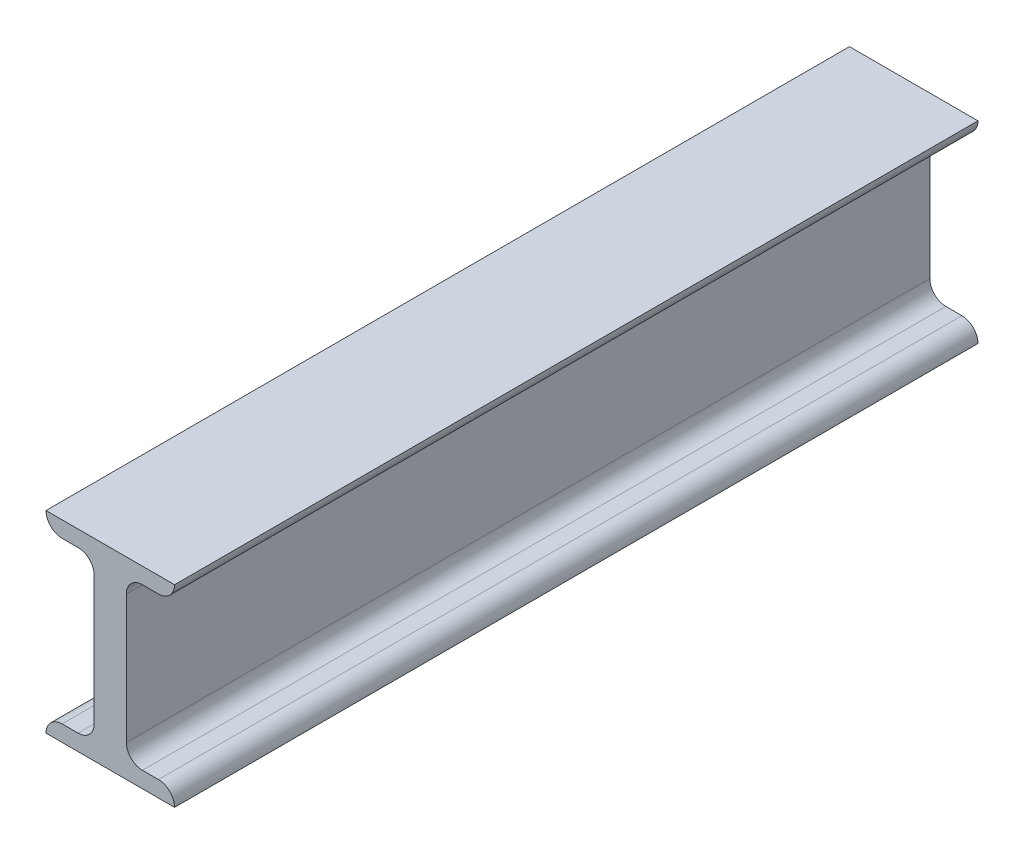
ISO-10303-21;
HEADER;
FILE_DESCRIPTION(('STEP AP214'),'2;1');
FILE_NAME('part.step','',(''),(''),'','','');
FILE_SCHEMA(('AUTOMOTIVE_DESIGN { 1 0 10303 214 1 1 1 1 }'));
ENDSEC;
DATA;
#1=APPLICATION_CONTEXT('core data for automotive mechanical design processes');
#2=APPLICATION_PROTOCOL_DEFINITION('international standard','automotive_design',2000,#1);
#3=PRODUCT_CONTEXT('',#1,'mechanical');
#4=PRODUCT('Part','Part','',(#3));
#5=PRODUCT_RELATED_PRODUCT_CATEGORY('part','',(#4));
#6=PRODUCT_DEFINITION_FORMATION('','',#4);
#7=PRODUCT_DEFINITION_CONTEXT('part definition',#1,'design');
#8=PRODUCT_DEFINITION('design','',#6,#7);
#9=PRODUCT_DEFINITION_SHAPE('','',#8);
#10=(LENGTH_UNIT() NAMED_UNIT(*) SI_UNIT(.MILLI.,.METRE.));
#11=(NAMED_UNIT(*) PLANE_ANGLE_UNIT() SI_UNIT($,.RADIAN.));
#12=(NAMED_UNIT(*) SI_UNIT($,.STERADIAN.) SOLID_ANGLE_UNIT());
#13=UNCERTAINTY_MEASURE_WITH_UNIT(LENGTH_MEASURE(1.E-05),#10,'distance_accuracy_value','');
#14=(GEOMETRIC_REPRESENTATION_CONTEXT(3) GLOBAL_UNCERTAINTY_ASSIGNED_CONTEXT((#13)) GLOBAL_UNIT_ASSIGNED_CONTEXT((#10,
#11,#12)) REPRESENTATION_CONTEXT('',''));
#15=CARTESIAN_POINT('',(0.,0.,0.));
#16=DIRECTION('',(0.,0.,1.));
#17=DIRECTION('',(1.,0.,0.));
#18=AXIS2_PLACEMENT_3D('',#15,#16,#17);
#19=CARTESIAN_POINT('',(0.,0.,250.));
#20=DIRECTION('',(0.,1.,0.));
#21=DIRECTION('',(0.,0.,1.));
#22=AXIS2_PLACEMENT_3D('',#19,#20,#21);
#23=PLANE('',#22);
#24=DIRECTION('',(1.,0.,0.));
#25=VECTOR('',#24,1.);
#26=CARTESIAN_POINT('',(0.,0.,0.));
#27=LINE('',#26,#25);
#28=CARTESIAN_POINT('',(0.,0.,0.));
#29=VERTEX_POINT('',#28);
#30=CARTESIAN_POINT('',(40.,0.,0.));
#31=VERTEX_POINT('',#30);
#32=EDGE_CURVE('E343',#29,#31,#27,.T.);
#33=ORIENTED_EDGE('',*,*,#32,.T.);
#34=DIRECTION('',(0.,0.,-1.));
#35=VECTOR('',#34,1.);
#36=CARTESIAN_POINT('',(40.,0.,250.));
#37=LINE('',#36,#35);
#38=CARTESIAN_POINT('',(40.,0.,250.));
#39=VERTEX_POINT('',#38);
#40=EDGE_CURVE('E175',#39,#31,#37,.T.);
#41=ORIENTED_EDGE('',*,*,#40,.F.);
#42=DIRECTION('',(1.,0.,0.));
#43=VECTOR('',#42,1.);
#44=CARTESIAN_POINT('',(0.,0.,250.));
#45=LINE('',#44,#43);
#46=CARTESIAN_POINT('',(0.,0.,250.));
#47=VERTEX_POINT('',#46);
#48=EDGE_CURVE('E161',#47,#39,#45,.T.);
#49=ORIENTED_EDGE('',*,*,#48,.F.);
#50=DIRECTION('',(0.,0.,-1.));
#51=VECTOR('',#50,1.);
#52=CARTESIAN_POINT('',(0.,0.,250.));
#53=LINE('',#52,#51);
#54=EDGE_CURVE('E173',#47,#29,#53,.T.);
#55=ORIENTED_EDGE('',*,*,#54,.T.);
#56=EDGE_LOOP('',(#33,#41,#49,#55));
#57=FACE_BOUND('',#56,.T.);
#58=ADVANCED_FACE('F44',(#57),#23,.F.);
#59=CARTESIAN_POINT('',(40.,5.,250.));
#60=DIRECTION('',(0.,-1.,0.));
#61=DIRECTION('',(0.,0.,-1.));
#62=AXIS2_PLACEMENT_3D('',#59,#60,#61);
#63=PLANE('',#62);
#64=DIRECTION('',(-1.,0.,0.));
#65=VECTOR('',#64,1.);
#66=CARTESIAN_POINT('',(40.,5.,250.));
#67=LINE('',#66,#65);
#68=CARTESIAN_POINT('',(35.,5.,250.));
#69=VERTEX_POINT('',#68);
#70=CARTESIAN_POINT('',(30.,5.,250.));
#71=VERTEX_POINT('',#70);
#72=EDGE_CURVE('E178',#69,#71,#67,.T.);
#73=ORIENTED_EDGE('',*,*,#72,.F.);
#74=DIRECTION('',(0.,0.,-1.));
#75=VECTOR('',#74,1.);
#76=CARTESIAN_POINT('',(35.,5.,250.));
#77=LINE('',#76,#75);
#78=CARTESIAN_POINT('',(35.,5.,0.));
#79=VERTEX_POINT('',#78);
#80=EDGE_CURVE('E229',#69,#79,#77,.T.);
#81=ORIENTED_EDGE('',*,*,#80,.T.);
#82=DIRECTION('',(-1.,0.,0.));
#83=VECTOR('',#82,1.);
#84=CARTESIAN_POINT('',(40.,5.,0.));
#85=LINE('',#84,#83);
#86=CARTESIAN_POINT('',(30.,5.,0.));
#87=VERTEX_POINT('',#86);
#88=EDGE_CURVE('E276',#79,#87,#85,.T.);
#89=ORIENTED_EDGE('',*,*,#88,.T.);
#90=DIRECTION('',(0.,0.,-1.));
#91=VECTOR('',#90,1.);
#92=CARTESIAN_POINT('',(30.,5.,250.));
#93=LINE('',#92,#91);
#94=EDGE_CURVE('E226',#87,#71,#93,.F.);
#95=ORIENTED_EDGE('',*,*,#94,.T.);
#96=EDGE_LOOP('',(#73,#81,#89,#95));
#97=FACE_BOUND('',#96,.T.);
#98=ADVANCED_FACE('F397',(#97),#63,.F.);
#99=CARTESIAN_POINT('',(25.,5.,250.));
#100=DIRECTION('',(-1.,0.,0.));
#101=DIRECTION('',(0.,0.,1.));
#102=AXIS2_PLACEMENT_3D('',#99,#100,#101);
#103=PLANE('',#102);
#104=DIRECTION('',(0.,1.,0.));
#105=VECTOR('',#104,1.);
#106=CARTESIAN_POINT('',(25.,5.,250.));
#107=LINE('',#106,#105);
#108=CARTESIAN_POINT('',(25.,10.,250.));
#109=VERTEX_POINT('',#108);
#110=CARTESIAN_POINT('',(25.,50.,250.));
#111=VERTEX_POINT('',#110);
#112=EDGE_CURVE('E283',#109,#111,#107,.T.);
#113=ORIENTED_EDGE('',*,*,#112,.F.);
#114=DIRECTION('',(0.,0.,-1.));
#115=VECTOR('',#114,1.);
#116=CARTESIAN_POINT('',(25.,10.,0.));
#117=LINE('',#116,#115);
#118=CARTESIAN_POINT('',(25.,10.,0.));
#119=VERTEX_POINT('',#118);
#120=EDGE_CURVE('E236',#109,#119,#117,.T.);
#121=ORIENTED_EDGE('',*,*,#120,.T.);
#122=DIRECTION('',(0.,1.,0.));
#123=VECTOR('',#122,1.);
#124=CARTESIAN_POINT('',(25.,5.,0.));
#125=LINE('',#124,#123);
#126=CARTESIAN_POINT('',(25.,50.,0.));
#127=VERTEX_POINT('',#126);
#128=EDGE_CURVE('E263',#119,#127,#125,.T.);
#129=ORIENTED_EDGE('',*,*,#128,.T.);
#130=DIRECTION('',(0.,0.,-1.));
#131=VECTOR('',#130,1.);
#132=CARTESIAN_POINT('',(25.,50.,250.));
#133=LINE('',#132,#131);
#134=EDGE_CURVE('E233',#127,#111,#133,.F.);
#135=ORIENTED_EDGE('',*,*,#134,.T.);
#136=EDGE_LOOP('',(#113,#121,#129,#135));
#137=FACE_BOUND('',#136,.T.);
#138=ADVANCED_FACE('F272',(#137),#103,.F.);
#139=CARTESIAN_POINT('',(25.,55.,250.));
#140=DIRECTION('',(0.,1.,0.));
#141=DIRECTION('',(0.,0.,1.));
#142=AXIS2_PLACEMENT_3D('',#139,#140,#141);
#143=PLANE('',#142);
#144=DIRECTION('',(1.,0.,0.));
#145=VECTOR('',#144,1.);
#146=CARTESIAN_POINT('',(25.,55.,0.));
#147=LINE('',#146,#145);
#148=CARTESIAN_POINT('',(30.,55.,0.));
#149=VERTEX_POINT('',#148);
#150=CARTESIAN_POINT('',(35.,55.,0.));
#151=VERTEX_POINT('',#150);
#152=EDGE_CURVE('E265',#149,#151,#147,.T.);
#153=ORIENTED_EDGE('',*,*,#152,.T.);
#154=DIRECTION('',(0.,0.,-1.));
#155=VECTOR('',#154,1.);
#156=CARTESIAN_POINT('',(35.,55.,250.));
#157=LINE('',#156,#155);
#158=CARTESIAN_POINT('',(35.,55.,250.));
#159=VERTEX_POINT('',#158);
#160=EDGE_CURVE('E287',#151,#159,#157,.F.);
#161=ORIENTED_EDGE('',*,*,#160,.T.);
#162=DIRECTION('',(1.,0.,0.));
#163=VECTOR('',#162,1.);
#164=CARTESIAN_POINT('',(25.,55.,250.));
#165=LINE('',#164,#163);
#166=CARTESIAN_POINT('',(30.,55.,250.));
#167=VERTEX_POINT('',#166);
#168=EDGE_CURVE('E281',#167,#159,#165,.T.);
#169=ORIENTED_EDGE('',*,*,#168,.F.);
#170=DIRECTION('',(0.,0.,-1.));
#171=VECTOR('',#170,1.);
#172=CARTESIAN_POINT('',(30.,55.,0.));
#173=LINE('',#172,#171);
#174=EDGE_CURVE('E279',#167,#149,#173,.T.);
#175=ORIENTED_EDGE('',*,*,#174,.T.);
#176=EDGE_LOOP('',(#153,#161,#169,#175));
#177=FACE_BOUND('',#176,.T.);
#178=ADVANCED_FACE('F285',(#177),#143,.F.);
#179=CARTESIAN_POINT('',(40.,60.,250.));
#180=DIRECTION('',(0.,-1.,0.));
#181=DIRECTION('',(0.,0.,-1.));
#182=AXIS2_PLACEMENT_3D('',#179,#180,#181);
#183=PLANE('',#182);
#184=DIRECTION('',(-1.,0.,0.));
#185=VECTOR('',#184,1.);
#186=CARTESIAN_POINT('',(40.,60.,0.));
#187=LINE('',#186,#185);
#188=CARTESIAN_POINT('',(40.,60.,0.));
#189=VERTEX_POINT('',#188);
#190=CARTESIAN_POINT('',(0.,60.,0.));
#191=VERTEX_POINT('',#190);
#192=EDGE_CURVE('E318',#189,#191,#187,.T.);
#193=ORIENTED_EDGE('',*,*,#192,.T.);
#194=DIRECTION('',(0.,0.,-1.));
#195=VECTOR('',#194,1.);
#196=CARTESIAN_POINT('',(0.,60.,250.));
#197=LINE('',#196,#195);
#198=CARTESIAN_POINT('',(0.,60.,250.));
#199=VERTEX_POINT('',#198);
#200=EDGE_CURVE('E303',#199,#191,#197,.T.);
#201=ORIENTED_EDGE('',*,*,#200,.F.);
#202=DIRECTION('',(-1.,0.,0.));
#203=VECTOR('',#202,1.);
#204=CARTESIAN_POINT('',(40.,60.,250.));
#205=LINE('',#204,#203);
#206=CARTESIAN_POINT('',(40.,60.,250.));
#207=VERTEX_POINT('',#206);
#208=EDGE_CURVE('E289',#207,#199,#205,.T.);
#209=ORIENTED_EDGE('',*,*,#208,.F.);
#210=DIRECTION('',(0.,0.,-1.));
#211=VECTOR('',#210,1.);
#212=CARTESIAN_POINT('',(40.,60.,250.));
#213=LINE('',#212,#211);
#214=EDGE_CURVE('E191',#207,#189,#213,.T.);
#215=ORIENTED_EDGE('',*,*,#214,.T.);
#216=EDGE_LOOP('',(#193,#201,#209,#215));
#217=FACE_BOUND('',#216,.T.);
#218=ADVANCED_FACE('F316',(#217),#183,.F.);
#219=CARTESIAN_POINT('',(0.,55.,250.));
#220=DIRECTION('',(0.,1.,0.));
#221=DIRECTION('',(0.,0.,1.));
#222=AXIS2_PLACEMENT_3D('',#219,#220,#221);
#223=PLANE('',#222);
#224=DIRECTION('',(1.,0.,0.));
#225=VECTOR('',#224,1.);
#226=CARTESIAN_POINT('',(0.,55.,250.));
#227=LINE('',#226,#225);
#228=CARTESIAN_POINT('',(5.,55.,250.));
#229=VERTEX_POINT('',#228);
#230=CARTESIAN_POINT('',(10.,55.,250.));
#231=VERTEX_POINT('',#230);
#232=EDGE_CURVE('E293',#229,#231,#227,.T.);
#233=ORIENTED_EDGE('',*,*,#232,.F.);
#234=DIRECTION('',(0.,0.,-1.));
#235=VECTOR('',#234,1.);
#236=CARTESIAN_POINT('',(5.,55.,250.));
#237=LINE('',#236,#235);
#238=CARTESIAN_POINT('',(5.,55.,0.));
#239=VERTEX_POINT('',#238);
#240=EDGE_CURVE('E222',#229,#239,#237,.T.);
#241=ORIENTED_EDGE('',*,*,#240,.T.);
#242=DIRECTION('',(1.,0.,0.));
#243=VECTOR('',#242,1.);
#244=CARTESIAN_POINT('',(0.,55.,0.));
#245=LINE('',#244,#243);
#246=CARTESIAN_POINT('',(10.,55.,0.));
#247=VERTEX_POINT('',#246);
#248=EDGE_CURVE('E323',#239,#247,#245,.T.);
#249=ORIENTED_EDGE('',*,*,#248,.T.);
#250=DIRECTION('',(0.,0.,-1.));
#251=VECTOR('',#250,1.);
#252=CARTESIAN_POINT('',(10.,55.,250.));
#253=LINE('',#252,#251);
#254=EDGE_CURVE('E219',#247,#231,#253,.F.);
#255=ORIENTED_EDGE('',*,*,#254,.T.);
#256=EDGE_LOOP('',(#233,#241,#249,#255));
#257=FACE_BOUND('',#256,.T.);
#258=ADVANCED_FACE('F500',(#257),#223,.F.);
#259=CARTESIAN_POINT('',(15.,55.,250.));
#260=DIRECTION('',(1.,0.,0.));
#261=DIRECTION('',(0.,1.,0.));
#262=AXIS2_PLACEMENT_3D('',#259,#260,#261);
#263=PLANE('',#262);
#264=DIRECTION('',(0.,-1.,0.));
#265=VECTOR('',#264,1.);
#266=CARTESIAN_POINT('',(15.,55.,0.));
#267=LINE('',#266,#265);
#268=CARTESIAN_POINT('',(15.,50.,0.));
#269=VERTEX_POINT('',#268);
#270=CARTESIAN_POINT('',(15.,10.,0.));
#271=VERTEX_POINT('',#270);
#272=EDGE_CURVE('E327',#269,#271,#267,.T.);
#273=ORIENTED_EDGE('',*,*,#272,.T.);
#274=DIRECTION('',(0.,0.,-1.));
#275=VECTOR('',#274,1.);
#276=CARTESIAN_POINT('',(15.,10.,250.));
#277=LINE('',#276,#275);
#278=CARTESIAN_POINT('',(15.,10.,250.));
#279=VERTEX_POINT('',#278);
#280=EDGE_CURVE('E216',#271,#279,#277,.F.);
#281=ORIENTED_EDGE('',*,*,#280,.T.);
#282=DIRECTION('',(0.,-1.,0.));
#283=VECTOR('',#282,1.);
#284=CARTESIAN_POINT('',(15.,55.,250.));
#285=LINE('',#284,#283);
#286=CARTESIAN_POINT('',(15.,50.,250.));
#287=VERTEX_POINT('',#286);
#288=EDGE_CURVE('E347',#287,#279,#285,.T.);
#289=ORIENTED_EDGE('',*,*,#288,.F.);
#290=DIRECTION('',(0.,0.,-1.));
#291=VECTOR('',#290,1.);
#292=CARTESIAN_POINT('',(15.,50.,0.));
#293=LINE('',#292,#291);
#294=EDGE_CURVE('E210',#287,#269,#293,.T.);
#295=ORIENTED_EDGE('',*,*,#294,.T.);
#296=EDGE_LOOP('',(#273,#281,#289,#295));
#297=FACE_BOUND('',#296,.T.);
#298=ADVANCED_FACE('F364',(#297),#263,.F.);
#299=CARTESIAN_POINT('',(15.,5.,250.));
#300=DIRECTION('',(0.,-1.,0.));
#301=DIRECTION('',(1.,0.,0.));
#302=AXIS2_PLACEMENT_3D('',#299,#300,#301);
#303=PLANE('',#302);
#304=DIRECTION('',(-1.,0.,0.));
#305=VECTOR('',#304,1.);
#306=CARTESIAN_POINT('',(15.,5.,250.));
#307=LINE('',#306,#305);
#308=CARTESIAN_POINT('',(10.,5.,250.));
#309=VERTEX_POINT('',#308);
#310=CARTESIAN_POINT('',(5.,5.,250.));
#311=VERTEX_POINT('',#310);
#312=EDGE_CURVE('E163',#309,#311,#307,.T.);
#313=ORIENTED_EDGE('',*,*,#312,.F.);
#314=DIRECTION('',(0.,0.,-1.));
#315=VECTOR('',#314,1.);
#316=CARTESIAN_POINT('',(10.,5.,0.));
#317=LINE('',#316,#315);
#318=CARTESIAN_POINT('',(10.,5.,0.));
#319=VERTEX_POINT('',#318);
#320=EDGE_CURVE('E205',#309,#319,#317,.T.);
#321=ORIENTED_EDGE('',*,*,#320,.T.);
#322=DIRECTION('',(-1.,0.,0.));
#323=VECTOR('',#322,1.);
#324=CARTESIAN_POINT('',(15.,5.,0.));
#325=LINE('',#324,#323);
#326=CARTESIAN_POINT('',(5.,5.,0.));
#327=VERTEX_POINT('',#326);
#328=EDGE_CURVE('E179',#319,#327,#325,.T.);
#329=ORIENTED_EDGE('',*,*,#328,.T.);
#330=DIRECTION('',(0.,0.,-1.));
#331=VECTOR('',#330,1.);
#332=CARTESIAN_POINT('',(5.,5.,250.));
#333=LINE('',#332,#331);
#334=EDGE_CURVE('E60',#327,#311,#333,.F.);
#335=ORIENTED_EDGE('',*,*,#334,.T.);
#336=EDGE_LOOP('',(#313,#321,#329,#335));
#337=FACE_BOUND('',#336,.T.);
#338=ADVANCED_FACE('F370',(#337),#303,.F.);
#339=CARTESIAN_POINT('',(0.,0.,250.));
#340=DIRECTION('',(0.,0.,1.));
#341=DIRECTION('',(1.,0.,0.));
#342=AXIS2_PLACEMENT_3D('',#339,#340,#341);
#343=PLANE('',#342);
#344=ORIENTED_EDGE('',*,*,#168,.T.);
#345=CARTESIAN_POINT('',(35.,60.,250.));
#346=DIRECTION('',(0.,0.,1.));
#347=DIRECTION('',(1.,0.,0.));
#348=AXIS2_PLACEMENT_3D('',#345,#346,#347);
#349=CIRCLE('',#348,5.);
#350=EDGE_CURVE('E167',#159,#207,#349,.T.);
#351=ORIENTED_EDGE('',*,*,#350,.T.);
#352=ORIENTED_EDGE('',*,*,#208,.T.);
#353=CARTESIAN_POINT('',(5.,60.,250.));
#354=DIRECTION('',(0.,0.,1.));
#355=DIRECTION('',(1.,0.,0.));
#356=AXIS2_PLACEMENT_3D('',#353,#354,#355);
#357=CIRCLE('',#356,5.);
#358=EDGE_CURVE('E168',#199,#229,#357,.T.);
#359=ORIENTED_EDGE('',*,*,#358,.T.);
#360=ORIENTED_EDGE('',*,*,#232,.T.);
#361=CARTESIAN_POINT('',(10.,50.,250.));
#362=DIRECTION('',(0.,0.,1.));
#363=DIRECTION('',(1.,0.,0.));
#364=AXIS2_PLACEMENT_3D('',#361,#362,#363);
#365=CIRCLE('',#364,5.);
#366=EDGE_CURVE('E248',#231,#287,#365,.F.);
#367=ORIENTED_EDGE('',*,*,#366,.T.);
#368=ORIENTED_EDGE('',*,*,#288,.T.);
#369=CARTESIAN_POINT('',(10.,10.,250.));
#370=DIRECTION('',(0.,0.,1.));
#371=DIRECTION('',(1.,0.,0.));
#372=AXIS2_PLACEMENT_3D('',#369,#370,#371);
#373=CIRCLE('',#372,5.);
#374=EDGE_CURVE('E67',#279,#309,#373,.F.);
#375=ORIENTED_EDGE('',*,*,#374,.T.);
#376=ORIENTED_EDGE('',*,*,#312,.T.);
#377=CARTESIAN_POINT('',(5.,0.,250.));
#378=DIRECTION('',(0.,0.,1.));
#379=DIRECTION('',(1.,0.,0.));
#380=AXIS2_PLACEMENT_3D('',#377,#378,#379);
#381=CIRCLE('',#380,5.);
#382=EDGE_CURVE('E157',#311,#47,#381,.T.);
#383=ORIENTED_EDGE('',*,*,#382,.T.);
#384=ORIENTED_EDGE('',*,*,#48,.T.);
#385=CARTESIAN_POINT('',(35.,0.,250.));
#386=DIRECTION('',(0.,0.,1.));
#387=DIRECTION('',(1.,0.,0.));
#388=AXIS2_PLACEMENT_3D('',#385,#386,#387);
#389=CIRCLE('',#388,5.);
#390=EDGE_CURVE('E378',#39,#69,#389,.T.);
#391=ORIENTED_EDGE('',*,*,#390,.T.);
#392=ORIENTED_EDGE('',*,*,#72,.T.);
#393=CARTESIAN_POINT('',(30.,10.,250.));
#394=DIRECTION('',(0.,0.,1.));
#395=DIRECTION('',(1.,0.,0.));
#396=AXIS2_PLACEMENT_3D('',#393,#394,#395);
#397=CIRCLE('',#396,5.);
#398=EDGE_CURVE('E254',#71,#109,#397,.F.);
#399=ORIENTED_EDGE('',*,*,#398,.T.);
#400=ORIENTED_EDGE('',*,*,#112,.T.);
#401=CARTESIAN_POINT('',(30.,50.,250.));
#402=DIRECTION('',(0.,0.,1.));
#403=DIRECTION('',(1.,0.,0.));
#404=AXIS2_PLACEMENT_3D('',#401,#402,#403);
#405=CIRCLE('',#404,5.);
#406=EDGE_CURVE('E12',#111,#167,#405,.F.);
#407=ORIENTED_EDGE('',*,*,#406,.T.);
#408=EDGE_LOOP('',(#344,#351,#352,#359,#360,#367,#368,#375,#376,#383,#384,#391,#392,#399,#400,#407));
#409=FACE_BOUND('',#408,.T.);
#410=ADVANCED_FACE('F160',(#409),#343,.T.);
#411=CARTESIAN_POINT('',(0.,0.,0.));
#412=DIRECTION('',(0.,0.,1.));
#413=DIRECTION('',(1.,0.,0.));
#414=AXIS2_PLACEMENT_3D('',#411,#412,#413);
#415=PLANE('',#414);
#416=ORIENTED_EDGE('',*,*,#192,.F.);
#417=CARTESIAN_POINT('',(35.,60.,0.));
#418=DIRECTION('',(0.,0.,1.));
#419=DIRECTION('',(1.,0.,0.));
#420=AXIS2_PLACEMENT_3D('',#417,#418,#419);
#421=CIRCLE('',#420,5.);
#422=EDGE_CURVE('E320',#189,#151,#421,.F.);
#423=ORIENTED_EDGE('',*,*,#422,.T.);
#424=ORIENTED_EDGE('',*,*,#152,.F.);
#425=CARTESIAN_POINT('',(30.,50.,0.));
#426=DIRECTION('',(0.,0.,1.));
#427=DIRECTION('',(1.,0.,0.));
#428=AXIS2_PLACEMENT_3D('',#425,#426,#427);
#429=CIRCLE('',#428,5.);
#430=EDGE_CURVE('E53',#149,#127,#429,.T.);
#431=ORIENTED_EDGE('',*,*,#430,.T.);
#432=ORIENTED_EDGE('',*,*,#128,.F.);
#433=CARTESIAN_POINT('',(30.,10.,0.));
#434=DIRECTION('',(0.,0.,1.));
#435=DIRECTION('',(1.,0.,0.));
#436=AXIS2_PLACEMENT_3D('',#433,#434,#435);
#437=CIRCLE('',#436,5.);
#438=EDGE_CURVE('E251',#119,#87,#437,.T.);
#439=ORIENTED_EDGE('',*,*,#438,.T.);
#440=ORIENTED_EDGE('',*,*,#88,.F.);
#441=CARTESIAN_POINT('',(35.,0.,0.));
#442=DIRECTION('',(0.,0.,1.));
#443=DIRECTION('',(1.,0.,0.));
#444=AXIS2_PLACEMENT_3D('',#441,#442,#443);
#445=CIRCLE('',#444,5.);
#446=EDGE_CURVE('E185',#79,#31,#445,.F.);
#447=ORIENTED_EDGE('',*,*,#446,.T.);
#448=ORIENTED_EDGE('',*,*,#32,.F.);
#449=CARTESIAN_POINT('',(5.,0.,0.));
#450=DIRECTION('',(0.,0.,1.));
#451=DIRECTION('',(1.,0.,0.));
#452=AXIS2_PLACEMENT_3D('',#449,#450,#451);
#453=CIRCLE('',#452,5.);
#454=EDGE_CURVE('E182',#29,#327,#453,.F.);
#455=ORIENTED_EDGE('',*,*,#454,.T.);
#456=ORIENTED_EDGE('',*,*,#328,.F.);
#457=CARTESIAN_POINT('',(10.,10.,0.));
#458=DIRECTION('',(0.,0.,1.));
#459=DIRECTION('',(1.,0.,0.));
#460=AXIS2_PLACEMENT_3D('',#457,#458,#459);
#461=CIRCLE('',#460,5.);
#462=EDGE_CURVE('E240',#319,#271,#461,.T.);
#463=ORIENTED_EDGE('',*,*,#462,.T.);
#464=ORIENTED_EDGE('',*,*,#272,.F.);
#465=CARTESIAN_POINT('',(10.,50.,0.));
#466=DIRECTION('',(0.,0.,1.));
#467=DIRECTION('',(1.,0.,0.));
#468=AXIS2_PLACEMENT_3D('',#465,#466,#467);
#469=CIRCLE('',#468,5.);
#470=EDGE_CURVE('E245',#269,#247,#469,.T.);
#471=ORIENTED_EDGE('',*,*,#470,.T.);
#472=ORIENTED_EDGE('',*,*,#248,.F.);
#473=CARTESIAN_POINT('',(5.,60.,0.));
#474=DIRECTION('',(0.,0.,1.));
#475=DIRECTION('',(1.,0.,0.));
#476=AXIS2_PLACEMENT_3D('',#473,#474,#475);
#477=CIRCLE('',#476,5.);
#478=EDGE_CURVE('E189',#239,#191,#477,.F.);
#479=ORIENTED_EDGE('',*,*,#478,.T.);
#480=EDGE_LOOP('',(#416,#423,#424,#431,#432,#439,#440,#447,#448,#455,#456,#463,#464,#471,#472,#479));
#481=FACE_BOUND('',#480,.T.);
#482=ADVANCED_FACE('F262',(#481),#415,.F.);
#483=CARTESIAN_POINT('',(35.,60.,250.));
#484=DIRECTION('',(0.,0.,-1.));
#485=DIRECTION('',(-1.,0.,0.));
#486=AXIS2_PLACEMENT_3D('',#483,#484,#485);
#487=CYLINDRICAL_SURFACE('',#486,5.);
#488=ORIENTED_EDGE('',*,*,#350,.F.);
#489=ORIENTED_EDGE('',*,*,#160,.F.);
#490=ORIENTED_EDGE('',*,*,#422,.F.);
#491=ORIENTED_EDGE('',*,*,#214,.F.);
#492=EDGE_LOOP('',(#488,#489,#490,#491));
#493=FACE_BOUND('',#492,.T.);
#494=ADVANCED_FACE('F416',(#493),#487,.T.);
#495=CARTESIAN_POINT('',(10.,10.,250.));
#496=DIRECTION('',(0.,0.,1.));
#497=DIRECTION('',(1.,0.,0.));
#498=AXIS2_PLACEMENT_3D('',#495,#496,#497);
#499=CYLINDRICAL_SURFACE('',#498,5.);
#500=ORIENTED_EDGE('',*,*,#374,.F.);
#501=ORIENTED_EDGE('',*,*,#280,.F.);
#502=ORIENTED_EDGE('',*,*,#462,.F.);
#503=ORIENTED_EDGE('',*,*,#320,.F.);
#504=EDGE_LOOP('',(#500,#501,#502,#503));
#505=FACE_BOUND('',#504,.T.);
#506=ADVANCED_FACE('F369',(#505),#499,.F.);
#507=CARTESIAN_POINT('',(5.,0.,250.));
#508=DIRECTION('',(0.,0.,-1.));
#509=DIRECTION('',(-1.,0.,0.));
#510=AXIS2_PLACEMENT_3D('',#507,#508,#509);
#511=CYLINDRICAL_SURFACE('',#510,5.);
#512=ORIENTED_EDGE('',*,*,#382,.F.);
#513=ORIENTED_EDGE('',*,*,#334,.F.);
#514=ORIENTED_EDGE('',*,*,#454,.F.);
#515=ORIENTED_EDGE('',*,*,#54,.F.);
#516=EDGE_LOOP('',(#512,#513,#514,#515));
#517=FACE_BOUND('',#516,.T.);
#518=ADVANCED_FACE('F181',(#517),#511,.T.);
#519=CARTESIAN_POINT('',(5.,60.,250.));
#520=DIRECTION('',(0.,0.,-1.));
#521=DIRECTION('',(-1.,0.,0.));
#522=AXIS2_PLACEMENT_3D('',#519,#520,#521);
#523=CYLINDRICAL_SURFACE('',#522,5.);
#524=ORIENTED_EDGE('',*,*,#358,.F.);
#525=ORIENTED_EDGE('',*,*,#200,.T.);
#526=ORIENTED_EDGE('',*,*,#478,.F.);
#527=ORIENTED_EDGE('',*,*,#240,.F.);
#528=EDGE_LOOP('',(#524,#525,#526,#527));
#529=FACE_BOUND('',#528,.T.);
#530=ADVANCED_FACE('F423',(#529),#523,.T.);
#531=CARTESIAN_POINT('',(10.,50.,250.));
#532=DIRECTION('',(0.,0.,1.));
#533=DIRECTION('',(1.,0.,0.));
#534=AXIS2_PLACEMENT_3D('',#531,#532,#533);
#535=CYLINDRICAL_SURFACE('',#534,5.);
#536=ORIENTED_EDGE('',*,*,#366,.F.);
#537=ORIENTED_EDGE('',*,*,#254,.F.);
#538=ORIENTED_EDGE('',*,*,#470,.F.);
#539=ORIENTED_EDGE('',*,*,#294,.F.);
#540=EDGE_LOOP('',(#536,#537,#538,#539));
#541=FACE_BOUND('',#540,.T.);
#542=ADVANCED_FACE('F361',(#541),#535,.F.);
#543=CARTESIAN_POINT('',(35.,0.,250.));
#544=DIRECTION('',(0.,0.,-1.));
#545=DIRECTION('',(-1.,0.,0.));
#546=AXIS2_PLACEMENT_3D('',#543,#544,#545);
#547=CYLINDRICAL_SURFACE('',#546,5.);
#548=ORIENTED_EDGE('',*,*,#390,.F.);
#549=ORIENTED_EDGE('',*,*,#40,.T.);
#550=ORIENTED_EDGE('',*,*,#446,.F.);
#551=ORIENTED_EDGE('',*,*,#80,.F.);
#552=EDGE_LOOP('',(#548,#549,#550,#551));
#553=FACE_BOUND('',#552,.T.);
#554=ADVANCED_FACE('F391',(#553),#547,.T.);
#555=CARTESIAN_POINT('',(30.,10.,250.));
#556=DIRECTION('',(0.,0.,1.));
#557=DIRECTION('',(1.,0.,0.));
#558=AXIS2_PLACEMENT_3D('',#555,#556,#557);
#559=CYLINDRICAL_SURFACE('',#558,5.);
#560=ORIENTED_EDGE('',*,*,#398,.F.);
#561=ORIENTED_EDGE('',*,*,#94,.F.);
#562=ORIENTED_EDGE('',*,*,#438,.F.);
#563=ORIENTED_EDGE('',*,*,#120,.F.);
#564=EDGE_LOOP('',(#560,#561,#562,#563));
#565=FACE_BOUND('',#564,.T.);
#566=ADVANCED_FACE('F401',(#565),#559,.F.);
#567=CARTESIAN_POINT('',(30.,50.,250.));
#568=DIRECTION('',(0.,0.,1.));
#569=DIRECTION('',(1.,0.,0.));
#570=AXIS2_PLACEMENT_3D('',#567,#568,#569);
#571=CYLINDRICAL_SURFACE('',#570,5.);
#572=ORIENTED_EDGE('',*,*,#406,.F.);
#573=ORIENTED_EDGE('',*,*,#134,.F.);
#574=ORIENTED_EDGE('',*,*,#430,.F.);
#575=ORIENTED_EDGE('',*,*,#174,.F.);
#576=EDGE_LOOP('',(#572,#573,#574,#575));
#577=FACE_BOUND('',#576,.T.);
#578=ADVANCED_FACE('F46',(#577),#571,.F.);
#579=CLOSED_SHELL('',(#58,#98,#138,#178,#218,#258,#298,#338,#410,#482,#494,#506,#518,#530,#542,
#554,#566,#578));
#580=MANIFOLD_SOLID_BREP('B2',#579);
#581=ADVANCED_BREP_SHAPE_REPRESENTATION('',(#18,#580),#14);
#582=SHAPE_DEFINITION_REPRESENTATION(#9,#581);
ENDSEC;
END-ISO-10303-21;
